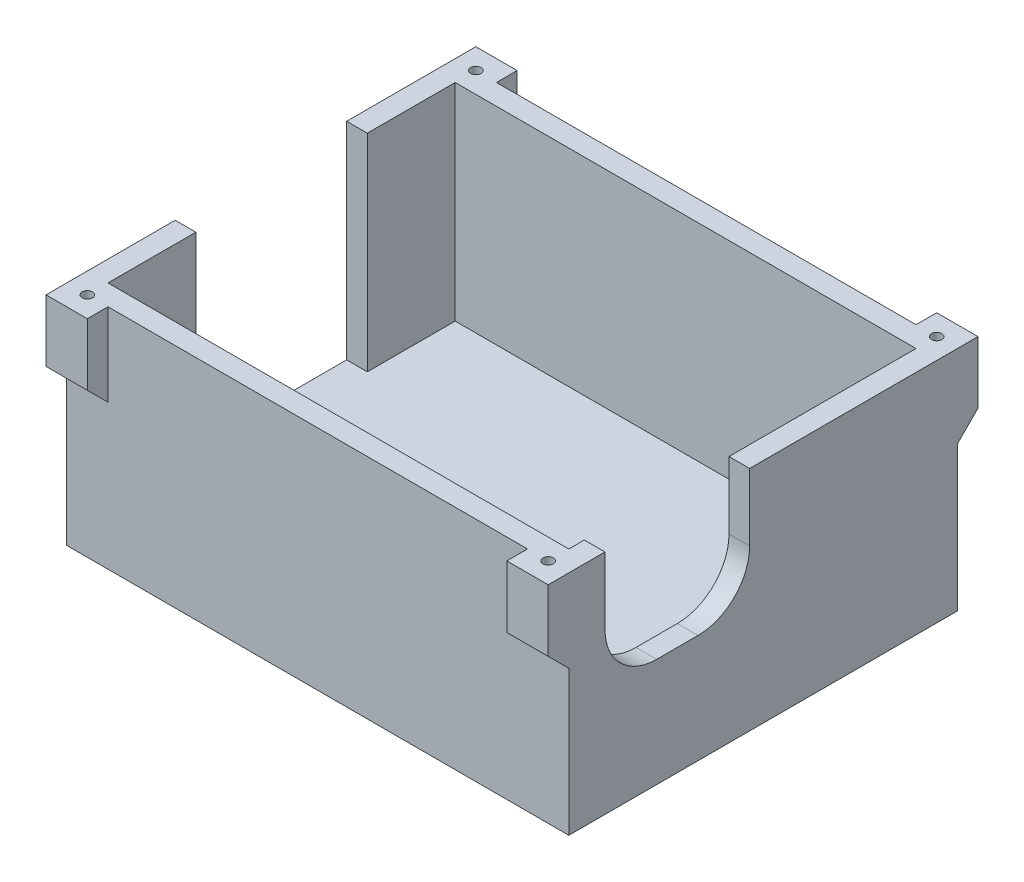
ISO-10303-21;
HEADER;
FILE_DESCRIPTION(('STEP AP214'),'2;1');
FILE_NAME('part.step','',(''),(''),'','','');
FILE_SCHEMA(('AUTOMOTIVE_DESIGN { 1 0 10303 214 1 1 1 1 }'));
ENDSEC;
DATA;
#1=APPLICATION_CONTEXT('core data for automotive mechanical design processes');
#2=APPLICATION_PROTOCOL_DEFINITION('international standard','automotive_design',2000,#1);
#3=PRODUCT_CONTEXT('',#1,'mechanical');
#4=PRODUCT('Part','Part','',(#3));
#5=PRODUCT_RELATED_PRODUCT_CATEGORY('part','',(#4));
#6=PRODUCT_DEFINITION_FORMATION('','',#4);
#7=PRODUCT_DEFINITION_CONTEXT('part definition',#1,'design');
#8=PRODUCT_DEFINITION('design','',#6,#7);
#9=PRODUCT_DEFINITION_SHAPE('','',#8);
#10=(LENGTH_UNIT() NAMED_UNIT(*) SI_UNIT(.MILLI.,.METRE.));
#11=(NAMED_UNIT(*) PLANE_ANGLE_UNIT() SI_UNIT($,.RADIAN.));
#12=(NAMED_UNIT(*) SI_UNIT($,.STERADIAN.) SOLID_ANGLE_UNIT());
#13=UNCERTAINTY_MEASURE_WITH_UNIT(LENGTH_MEASURE(1.E-05),#10,'distance_accuracy_value','');
#14=(GEOMETRIC_REPRESENTATION_CONTEXT(3) GLOBAL_UNCERTAINTY_ASSIGNED_CONTEXT((#13)) GLOBAL_UNIT_ASSIGNED_CONTEXT((#10,
#11,#12)) REPRESENTATION_CONTEXT('',''));
#15=CARTESIAN_POINT('',(0.,0.,0.));
#16=DIRECTION('',(0.,0.,1.));
#17=DIRECTION('',(1.,0.,0.));
#18=AXIS2_PLACEMENT_3D('',#15,#16,#17);
#19=CARTESIAN_POINT('',(0.,2.,-35.3));
#20=DIRECTION('',(0.,0.,-1.));
#21=DIRECTION('',(-1.,0.,0.));
#22=AXIS2_PLACEMENT_3D('',#19,#20,#21);
#23=PLANE('',#22);
#24=DIRECTION('',(0.,-1.,0.));
#25=VECTOR('',#24,1.);
#26=CARTESIAN_POINT('',(-2.3,2.,-35.3));
#27=LINE('',#26,#25);
#28=CARTESIAN_POINT('',(-2.3,14.,-35.3));
#29=VERTEX_POINT('',#28);
#30=CARTESIAN_POINT('',(-2.3,0.,-35.3));
#31=VERTEX_POINT('',#30);
#32=EDGE_CURVE('E418',#29,#31,#27,.T.);
#33=ORIENTED_EDGE('',*,*,#32,.F.);
#34=DIRECTION('',(1.,0.,0.));
#35=VECTOR('',#34,1.);
#36=CARTESIAN_POINT('',(1.7,14.,-35.3));
#37=LINE('',#36,#35);
#38=CARTESIAN_POINT('',(1.7,14.,-35.3));
#39=VERTEX_POINT('',#38);
#40=EDGE_CURVE('E451',#29,#39,#37,.T.);
#41=ORIENTED_EDGE('',*,*,#40,.T.);
#42=DIRECTION('',(0.,1.,0.));
#43=VECTOR('',#42,1.);
#44=CARTESIAN_POINT('',(1.7,16.,-35.3));
#45=LINE('',#44,#43);
#46=CARTESIAN_POINT('',(1.7,22.,-35.3));
#47=VERTEX_POINT('',#46);
#48=EDGE_CURVE('E54',#39,#47,#45,.T.);
#49=ORIENTED_EDGE('',*,*,#48,.T.);
#50=DIRECTION('',(1.,0.,0.));
#51=VECTOR('',#50,1.);
#52=CARTESIAN_POINT('',(0.,22.,-35.3));
#53=LINE('',#52,#51);
#54=CARTESIAN_POINT('',(42.3,22.,-35.3));
#55=VERTEX_POINT('',#54);
#56=EDGE_CURVE('E367',#47,#55,#53,.T.);
#57=ORIENTED_EDGE('',*,*,#56,.T.);
#58=DIRECTION('',(0.,1.,0.));
#59=VECTOR('',#58,1.);
#60=CARTESIAN_POINT('',(42.3,16.,-35.3));
#61=LINE('',#60,#59);
#62=CARTESIAN_POINT('',(42.3,14.,-35.3));
#63=VERTEX_POINT('',#62);
#64=EDGE_CURVE('E62',#63,#55,#61,.T.);
#65=ORIENTED_EDGE('',*,*,#64,.F.);
#66=DIRECTION('',(1.,0.,0.));
#67=VECTOR('',#66,1.);
#68=CARTESIAN_POINT('',(0.,14.,-35.3));
#69=LINE('',#68,#67);
#70=CARTESIAN_POINT('',(46.3,14.,-35.3));
#71=VERTEX_POINT('',#70);
#72=EDGE_CURVE('E449',#63,#71,#69,.T.);
#73=ORIENTED_EDGE('',*,*,#72,.T.);
#74=DIRECTION('',(0.,-1.,0.));
#75=VECTOR('',#74,1.);
#76=CARTESIAN_POINT('',(46.3,2.,-35.3));
#77=LINE('',#76,#75);
#78=CARTESIAN_POINT('',(46.3,0.,-35.3));
#79=VERTEX_POINT('',#78);
#80=EDGE_CURVE('E242',#71,#79,#77,.T.);
#81=ORIENTED_EDGE('',*,*,#80,.T.);
#82=DIRECTION('',(1.,0.,0.));
#83=VECTOR('',#82,1.);
#84=CARTESIAN_POINT('',(0.,0.,-35.3));
#85=LINE('',#84,#83);
#86=EDGE_CURVE('E415',#31,#79,#85,.T.);
#87=ORIENTED_EDGE('',*,*,#86,.F.);
#88=EDGE_LOOP('',(#33,#41,#49,#57,#65,#73,#81,#87));
#89=FACE_BOUND('',#88,.T.);
#90=ADVANCED_FACE('F38',(#89),#23,.T.);
#91=CARTESIAN_POINT('',(0.,22.,0.));
#92=DIRECTION('',(0.,1.,0.));
#93=DIRECTION('',(0.,0.,1.));
#94=AXIS2_PLACEMENT_3D('',#91,#92,#93);
#95=PLANE('',#94);
#96=CARTESIAN_POINT('',(44.3,22.,-35.3));
#97=DIRECTION('',(0.,1.,0.));
#98=DIRECTION('',(0.,0.,1.));
#99=AXIS2_PLACEMENT_3D('',#96,#97,#98);
#100=CIRCLE('',#99,0.499999999999999);
#101=CARTESIAN_POINT('',(44.3,22.,-34.8));
#102=VERTEX_POINT('',#101);
#103=EDGE_CURVE('E969',#102,#102,#100,.T.);
#104=ORIENTED_EDGE('',*,*,#103,.F.);
#105=EDGE_LOOP('',(#104));
#106=FACE_BOUND('',#105,.T.);
#107=CARTESIAN_POINT('',(-0.300000000000002,22.,-35.3));
#108=DIRECTION('',(0.,1.,0.));
#109=DIRECTION('',(0.,0.,1.));
#110=AXIS2_PLACEMENT_3D('',#107,#108,#109);
#111=CIRCLE('',#110,0.5);
#112=CARTESIAN_POINT('',(-0.300000000000002,22.,-34.8));
#113=VERTEX_POINT('',#112);
#114=EDGE_CURVE('E968',#113,#113,#111,.T.);
#115=ORIENTED_EDGE('',*,*,#114,.F.);
#116=EDGE_LOOP('',(#115));
#117=FACE_BOUND('',#116,.T.);
#118=DIRECTION('',(-1.,0.,0.));
#119=VECTOR('',#118,1.);
#120=CARTESIAN_POINT('',(44.3,22.,-15.2));
#121=LINE('',#120,#119);
#122=CARTESIAN_POINT('',(46.3,22.,-15.2));
#123=VERTEX_POINT('',#122);
#124=CARTESIAN_POINT('',(44.3,22.,-15.2));
#125=VERTEX_POINT('',#124);
#126=EDGE_CURVE('E327',#123,#125,#121,.T.);
#127=ORIENTED_EDGE('',*,*,#126,.F.);
#128=DIRECTION('',(0.,0.,-1.));
#129=VECTOR('',#128,1.);
#130=CARTESIAN_POINT('',(46.3,22.,0.));
#131=LINE('',#130,#129);
#132=CARTESIAN_POINT('',(46.3,22.,-37.3));
#133=VERTEX_POINT('',#132);
#134=EDGE_CURVE('E369',#123,#133,#131,.T.);
#135=ORIENTED_EDGE('',*,*,#134,.T.);
#136=DIRECTION('',(-1.,0.,0.));
#137=VECTOR('',#136,1.);
#138=CARTESIAN_POINT('',(46.3,22.,-37.3));
#139=LINE('',#138,#137);
#140=CARTESIAN_POINT('',(42.3,22.,-37.3));
#141=VERTEX_POINT('',#140);
#142=EDGE_CURVE('E253',#133,#141,#139,.T.);
#143=ORIENTED_EDGE('',*,*,#142,.T.);
#144=DIRECTION('',(0.,0.,1.));
#145=VECTOR('',#144,1.);
#146=CARTESIAN_POINT('',(42.3,22.,-35.3));
#147=LINE('',#146,#145);
#148=EDGE_CURVE('E256',#141,#55,#147,.T.);
#149=ORIENTED_EDGE('',*,*,#148,.T.);
#150=ORIENTED_EDGE('',*,*,#56,.F.);
#151=DIRECTION('',(0.,0.,-1.));
#152=VECTOR('',#151,1.);
#153=CARTESIAN_POINT('',(1.7,22.,-35.3));
#154=LINE('',#153,#152);
#155=CARTESIAN_POINT('',(1.7,22.,-37.3));
#156=VERTEX_POINT('',#155);
#157=EDGE_CURVE('E267',#47,#156,#154,.T.);
#158=ORIENTED_EDGE('',*,*,#157,.T.);
#159=DIRECTION('',(-1.,0.,0.));
#160=VECTOR('',#159,1.);
#161=CARTESIAN_POINT('',(-2.3,22.,-37.3));
#162=LINE('',#161,#160);
#163=CARTESIAN_POINT('',(-2.3,22.,-37.3));
#164=VERTEX_POINT('',#163);
#165=EDGE_CURVE('E272',#156,#164,#162,.T.);
#166=ORIENTED_EDGE('',*,*,#165,.T.);
#167=DIRECTION('',(0.,0.,-1.));
#168=VECTOR('',#167,1.);
#169=CARTESIAN_POINT('',(-2.3,22.,0.));
#170=LINE('',#169,#168);
#171=CARTESIAN_POINT('',(-2.3,22.,-24.8));
#172=VERTEX_POINT('',#171);
#173=EDGE_CURVE('E375',#172,#164,#170,.T.);
#174=ORIENTED_EDGE('',*,*,#173,.F.);
#175=DIRECTION('',(-1.,0.,0.));
#176=VECTOR('',#175,1.);
#177=CARTESIAN_POINT('',(-0.3,22.,-24.8));
#178=LINE('',#177,#176);
#179=CARTESIAN_POINT('',(-0.3,22.,-24.8));
#180=VERTEX_POINT('',#179);
#181=EDGE_CURVE('E324',#180,#172,#178,.T.);
#182=ORIENTED_EDGE('',*,*,#181,.F.);
#183=DIRECTION('',(0.,0.,-1.));
#184=VECTOR('',#183,1.);
#185=CARTESIAN_POINT('',(-0.3,22.,0.));
#186=LINE('',#185,#184);
#187=CARTESIAN_POINT('',(-0.3,22.,-33.3));
#188=VERTEX_POINT('',#187);
#189=EDGE_CURVE('E360',#180,#188,#186,.T.);
#190=ORIENTED_EDGE('',*,*,#189,.T.);
#191=DIRECTION('',(1.,0.,0.));
#192=VECTOR('',#191,1.);
#193=CARTESIAN_POINT('',(0.,22.,-33.3));
#194=LINE('',#193,#192);
#195=CARTESIAN_POINT('',(44.3,22.,-33.3));
#196=VERTEX_POINT('',#195);
#197=EDGE_CURVE('E357',#188,#196,#194,.T.);
#198=ORIENTED_EDGE('',*,*,#197,.T.);
#199=DIRECTION('',(0.,0.,-1.));
#200=VECTOR('',#199,1.);
#201=CARTESIAN_POINT('',(44.3,22.,0.));
#202=LINE('',#201,#200);
#203=EDGE_CURVE('E391',#125,#196,#202,.T.);
#204=ORIENTED_EDGE('',*,*,#203,.F.);
#205=EDGE_LOOP('',(#127,#135,#143,#149,#150,#158,#166,#174,#182,#190,#198,#204));
#206=FACE_BOUND('',#205,.T.);
#207=ADVANCED_FACE('F484',(#106,#117,#206),#95,.T.);
#208=CARTESIAN_POINT('',(-0.3,103.44688763477,0.));
#209=DIRECTION('',(-1.,0.,0.));
#210=DIRECTION('',(0.,0.,1.));
#211=AXIS2_PLACEMENT_3D('',#208,#209,#210);
#212=PLANE('',#211);
#213=DIRECTION('',(0.,0.,1.));
#214=VECTOR('',#213,1.);
#215=CARTESIAN_POINT('',(-0.3,2.,0.));
#216=LINE('',#215,#214);
#217=CARTESIAN_POINT('',(-0.3,2.,-8.2));
#218=VERTEX_POINT('',#217);
#219=CARTESIAN_POINT('',(-0.3,2.,0.3));
#220=VERTEX_POINT('',#219);
#221=EDGE_CURVE('E398',#218,#220,#216,.T.);
#222=ORIENTED_EDGE('',*,*,#221,.F.);
#223=DIRECTION('',(0.,1.,0.));
#224=VECTOR('',#223,1.);
#225=CARTESIAN_POINT('',(-0.3,-14.7200478468215,-8.2));
#226=LINE('',#225,#224);
#227=CARTESIAN_POINT('',(-0.3,22.,-8.2));
#228=VERTEX_POINT('',#227);
#229=EDGE_CURVE('E341',#218,#228,#226,.T.);
#230=ORIENTED_EDGE('',*,*,#229,.T.);
#231=CARTESIAN_POINT('',(-0.3,22.,0.3));
#232=VERTEX_POINT('',#231);
#233=EDGE_CURVE('E361',#232,#228,#186,.T.);
#234=ORIENTED_EDGE('',*,*,#233,.F.);
#235=DIRECTION('',(0.,-1.,0.));
#236=VECTOR('',#235,1.);
#237=CARTESIAN_POINT('',(-0.3,103.44688763477,0.3));
#238=LINE('',#237,#236);
#239=EDGE_CURVE('E388',#232,#220,#238,.T.);
#240=ORIENTED_EDGE('',*,*,#239,.T.);
#241=EDGE_LOOP('',(#222,#230,#234,#240));
#242=FACE_BOUND('',#241,.T.);
#243=ADVANCED_FACE('F580',(#242),#212,.F.);
#244=CARTESIAN_POINT('',(-2.3,2.,0.));
#245=DIRECTION('',(-1.,0.,0.));
#246=DIRECTION('',(0.,0.,1.));
#247=AXIS2_PLACEMENT_3D('',#244,#245,#246);
#248=PLANE('',#247);
#249=DIRECTION('',(0.,1.,0.));
#250=VECTOR('',#249,1.);
#251=CARTESIAN_POINT('',(-2.3,-14.7200478468215,-8.2));
#252=LINE('',#251,#250);
#253=CARTESIAN_POINT('',(-2.3,2.,-8.2));
#254=VERTEX_POINT('',#253);
#255=CARTESIAN_POINT('',(-2.3,22.,-8.2));
#256=VERTEX_POINT('',#255);
#257=EDGE_CURVE('E350',#254,#256,#252,.T.);
#258=ORIENTED_EDGE('',*,*,#257,.F.);
#259=DIRECTION('',(0.,0.,-1.));
#260=VECTOR('',#259,1.);
#261=CARTESIAN_POINT('',(-2.3,2.,-8.2));
#262=LINE('',#261,#260);
#263=CARTESIAN_POINT('',(-2.3,2.,-24.8));
#264=VERTEX_POINT('',#263);
#265=EDGE_CURVE('E337',#254,#264,#262,.T.);
#266=ORIENTED_EDGE('',*,*,#265,.T.);
#267=DIRECTION('',(0.,1.,0.));
#268=VECTOR('',#267,1.);
#269=CARTESIAN_POINT('',(-2.3,-14.7200478468215,-24.8));
#270=LINE('',#269,#268);
#271=EDGE_CURVE('E352',#264,#172,#270,.T.);
#272=ORIENTED_EDGE('',*,*,#271,.T.);
#273=ORIENTED_EDGE('',*,*,#173,.T.);
#274=DIRECTION('',(0.,1.,0.));
#275=VECTOR('',#274,1.);
#276=CARTESIAN_POINT('',(-2.3,16.,-37.3));
#277=LINE('',#276,#275);
#278=CARTESIAN_POINT('',(-2.3,16.,-37.3));
#279=VERTEX_POINT('',#278);
#280=EDGE_CURVE('E277',#279,#164,#277,.T.);
#281=ORIENTED_EDGE('',*,*,#280,.F.);
#282=DIRECTION('',(0.,0.707106781186551,-0.707106781186544));
#283=VECTOR('',#282,1.);
#284=CARTESIAN_POINT('',(-2.3,14.,-35.3));
#285=LINE('',#284,#283);
#286=EDGE_CURVE('E246',#279,#29,#285,.F.);
#287=ORIENTED_EDGE('',*,*,#286,.T.);
#288=ORIENTED_EDGE('',*,*,#32,.T.);
#289=DIRECTION('',(0.,0.,-1.));
#290=VECTOR('',#289,1.);
#291=CARTESIAN_POINT('',(-2.3,0.,0.));
#292=LINE('',#291,#290);
#293=CARTESIAN_POINT('',(-2.3,0.,2.3));
#294=VERTEX_POINT('',#293);
#295=EDGE_CURVE('E407',#294,#31,#292,.T.);
#296=ORIENTED_EDGE('',*,*,#295,.F.);
#297=DIRECTION('',(0.,-1.,0.));
#298=VECTOR('',#297,1.);
#299=CARTESIAN_POINT('',(-2.3,2.,2.3));
#300=LINE('',#299,#298);
#301=CARTESIAN_POINT('',(-2.3,14.,2.3));
#302=VERTEX_POINT('',#301);
#303=EDGE_CURVE('E423',#302,#294,#300,.T.);
#304=ORIENTED_EDGE('',*,*,#303,.F.);
#305=DIRECTION('',(0.,-0.707106781186552,-0.707106781186543));
#306=VECTOR('',#305,1.);
#307=CARTESIAN_POINT('',(-2.3,14.,2.3));
#308=LINE('',#307,#306);
#309=CARTESIAN_POINT('',(-2.3,16.,4.3));
#310=VERTEX_POINT('',#309);
#311=EDGE_CURVE('E454',#302,#310,#308,.F.);
#312=ORIENTED_EDGE('',*,*,#311,.T.);
#313=DIRECTION('',(0.,1.,0.));
#314=VECTOR('',#313,1.);
#315=CARTESIAN_POINT('',(-2.3,16.,4.3));
#316=LINE('',#315,#314);
#317=CARTESIAN_POINT('',(-2.3,22.,4.3));
#318=VERTEX_POINT('',#317);
#319=EDGE_CURVE('E287',#310,#318,#316,.T.);
#320=ORIENTED_EDGE('',*,*,#319,.T.);
#321=EDGE_CURVE('E376',#318,#256,#170,.T.);
#322=ORIENTED_EDGE('',*,*,#321,.T.);
#323=EDGE_LOOP('',(#258,#266,#272,#273,#281,#287,#288,#296,#304,#312,#320,#322));
#324=FACE_BOUND('',#323,.T.);
#325=ADVANCED_FACE('F469',(#324),#248,.T.);
#326=CARTESIAN_POINT('',(0.,2.,2.3));
#327=DIRECTION('',(0.,0.,-1.));
#328=DIRECTION('',(-1.,0.,0.));
#329=AXIS2_PLACEMENT_3D('',#326,#327,#328);
#330=PLANE('',#329);
#331=DIRECTION('',(0.,1.,0.));
#332=VECTOR('',#331,1.);
#333=CARTESIAN_POINT('',(1.7,16.,2.3));
#334=LINE('',#333,#332);
#335=CARTESIAN_POINT('',(1.7,14.,2.3));
#336=VERTEX_POINT('',#335);
#337=CARTESIAN_POINT('',(1.7,22.,2.3));
#338=VERTEX_POINT('',#337);
#339=EDGE_CURVE('E292',#336,#338,#334,.T.);
#340=ORIENTED_EDGE('',*,*,#339,.F.);
#341=DIRECTION('',(-1.,0.,0.));
#342=VECTOR('',#341,1.);
#343=CARTESIAN_POINT('',(-2.3,14.,2.3));
#344=LINE('',#343,#342);
#345=EDGE_CURVE('E446',#336,#302,#344,.T.);
#346=ORIENTED_EDGE('',*,*,#345,.T.);
#347=ORIENTED_EDGE('',*,*,#303,.T.);
#348=DIRECTION('',(1.,0.,0.));
#349=VECTOR('',#348,1.);
#350=CARTESIAN_POINT('',(0.,0.,2.3));
#351=LINE('',#350,#349);
#352=CARTESIAN_POINT('',(46.3,0.,2.3));
#353=VERTEX_POINT('',#352);
#354=EDGE_CURVE('E410',#294,#353,#351,.T.);
#355=ORIENTED_EDGE('',*,*,#354,.T.);
#356=DIRECTION('',(0.,-1.,0.));
#357=VECTOR('',#356,1.);
#358=CARTESIAN_POINT('',(46.3,2.,2.3));
#359=LINE('',#358,#357);
#360=CARTESIAN_POINT('',(46.3,14.,2.3));
#361=VERTEX_POINT('',#360);
#362=EDGE_CURVE('E421',#361,#353,#359,.T.);
#363=ORIENTED_EDGE('',*,*,#362,.F.);
#364=DIRECTION('',(-1.,0.,0.));
#365=VECTOR('',#364,1.);
#366=CARTESIAN_POINT('',(0.,14.,2.3));
#367=LINE('',#366,#365);
#368=CARTESIAN_POINT('',(42.3,14.,2.3));
#369=VERTEX_POINT('',#368);
#370=EDGE_CURVE('E443',#361,#369,#367,.T.);
#371=ORIENTED_EDGE('',*,*,#370,.T.);
#372=DIRECTION('',(0.,1.,0.));
#373=VECTOR('',#372,1.);
#374=CARTESIAN_POINT('',(42.3,16.,2.3));
#375=LINE('',#374,#373);
#376=CARTESIAN_POINT('',(42.3,22.,2.3));
#377=VERTEX_POINT('',#376);
#378=EDGE_CURVE('E303',#369,#377,#375,.T.);
#379=ORIENTED_EDGE('',*,*,#378,.T.);
#380=DIRECTION('',(1.,0.,0.));
#381=VECTOR('',#380,1.);
#382=CARTESIAN_POINT('',(0.,22.,2.3));
#383=LINE('',#382,#381);
#384=EDGE_CURVE('E373',#338,#377,#383,.T.);
#385=ORIENTED_EDGE('',*,*,#384,.F.);
#386=EDGE_LOOP('',(#340,#346,#347,#355,#363,#371,#379,#385));
#387=FACE_BOUND('',#386,.T.);
#388=ADVANCED_FACE('F530',(#387),#330,.F.);
#389=CARTESIAN_POINT('',(46.3,2.,0.));
#390=DIRECTION('',(-1.,0.,0.));
#391=DIRECTION('',(0.,0.,1.));
#392=AXIS2_PLACEMENT_3D('',#389,#390,#391);
#393=PLANE('',#392);
#394=ORIENTED_EDGE('',*,*,#134,.F.);
#395=DIRECTION('',(0.,1.,0.));
#396=VECTOR('',#395,1.);
#397=CARTESIAN_POINT('',(46.3,-12.142135623731,-15.2));
#398=LINE('',#397,#396);
#399=CARTESIAN_POINT('',(46.3,15.5,-15.2));
#400=VERTEX_POINT('',#399);
#401=EDGE_CURVE('E332',#400,#123,#398,.T.);
#402=ORIENTED_EDGE('',*,*,#401,.F.);
#403=CARTESIAN_POINT('',(46.3,15.5,-10.2));
#404=DIRECTION('',(-1.,0.,0.));
#405=DIRECTION('',(0.,0.,1.));
#406=AXIS2_PLACEMENT_3D('',#403,#404,#405);
#407=CIRCLE('',#406,5.);
#408=CARTESIAN_POINT('',(46.3,10.5,-10.2));
#409=VERTEX_POINT('',#408);
#410=EDGE_CURVE('E435',#400,#409,#407,.T.);
#411=ORIENTED_EDGE('',*,*,#410,.T.);
#412=DIRECTION('',(0.,0.,1.));
#413=VECTOR('',#412,1.);
#414=CARTESIAN_POINT('',(46.3,10.5,-1.2));
#415=LINE('',#414,#413);
#416=CARTESIAN_POINT('',(46.3,10.5,-6.2));
#417=VERTEX_POINT('',#416);
#418=EDGE_CURVE('E317',#409,#417,#415,.T.);
#419=ORIENTED_EDGE('',*,*,#418,.T.);
#420=CARTESIAN_POINT('',(46.3,15.5,-6.2));
#421=DIRECTION('',(-1.,0.,0.));
#422=DIRECTION('',(0.,0.,1.));
#423=AXIS2_PLACEMENT_3D('',#420,#421,#422);
#424=CIRCLE('',#423,5.);
#425=CARTESIAN_POINT('',(46.3,15.5,-1.2));
#426=VERTEX_POINT('',#425);
#427=EDGE_CURVE('E441',#417,#426,#424,.T.);
#428=ORIENTED_EDGE('',*,*,#427,.T.);
#429=DIRECTION('',(0.,1.,0.));
#430=VECTOR('',#429,1.);
#431=CARTESIAN_POINT('',(46.3,-12.142135623731,-1.2));
#432=LINE('',#431,#430);
#433=CARTESIAN_POINT('',(46.3,22.,-1.2));
#434=VERTEX_POINT('',#433);
#435=EDGE_CURVE('E334',#426,#434,#432,.T.);
#436=ORIENTED_EDGE('',*,*,#435,.T.);
#437=CARTESIAN_POINT('',(46.3,22.,4.3));
#438=VERTEX_POINT('',#437);
#439=EDGE_CURVE('E370',#438,#434,#131,.T.);
#440=ORIENTED_EDGE('',*,*,#439,.F.);
#441=DIRECTION('',(0.,1.,0.));
#442=VECTOR('',#441,1.);
#443=CARTESIAN_POINT('',(46.3,16.,4.3));
#444=LINE('',#443,#442);
#445=CARTESIAN_POINT('',(46.3,16.,4.3));
#446=VERTEX_POINT('',#445);
#447=EDGE_CURVE('E309',#446,#438,#444,.T.);
#448=ORIENTED_EDGE('',*,*,#447,.F.);
#449=DIRECTION('',(0.,-0.707106781186552,-0.707106781186543));
#450=VECTOR('',#449,1.);
#451=CARTESIAN_POINT('',(46.3,6.8499999999999,-4.84999999999998));
#452=LINE('',#451,#450);
#453=EDGE_CURVE('E461',#446,#361,#452,.T.);
#454=ORIENTED_EDGE('',*,*,#453,.T.);
#455=ORIENTED_EDGE('',*,*,#362,.T.);
#456=DIRECTION('',(0.,0.,-1.));
#457=VECTOR('',#456,1.);
#458=CARTESIAN_POINT('',(46.3,0.,0.));
#459=LINE('',#458,#457);
#460=EDGE_CURVE('E413',#353,#79,#459,.T.);
#461=ORIENTED_EDGE('',*,*,#460,.T.);
#462=ORIENTED_EDGE('',*,*,#80,.F.);
#463=DIRECTION('',(0.,0.707106781186551,-0.707106781186544));
#464=VECTOR('',#463,1.);
#465=CARTESIAN_POINT('',(46.3,-9.65000000000007,-11.6500000000002));
#466=LINE('',#465,#464);
#467=CARTESIAN_POINT('',(46.3,16.,-37.3));
#468=VERTEX_POINT('',#467);
#469=EDGE_CURVE('E47',#71,#468,#466,.T.);
#470=ORIENTED_EDGE('',*,*,#469,.T.);
#471=DIRECTION('',(0.,1.,0.));
#472=VECTOR('',#471,1.);
#473=CARTESIAN_POINT('',(46.3,16.,-37.3));
#474=LINE('',#473,#472);
#475=EDGE_CURVE('E239',#468,#133,#474,.T.);
#476=ORIENTED_EDGE('',*,*,#475,.T.);
#477=EDGE_LOOP('',(#394,#402,#411,#419,#428,#436,#440,#448,#454,#455,#461,#462,#470,#476));
#478=FACE_BOUND('',#477,.T.);
#479=ADVANCED_FACE('F238',(#478),#393,.F.);
#480=CARTESIAN_POINT('',(0.,0.,0.));
#481=DIRECTION('',(0.,1.,0.));
#482=DIRECTION('',(0.,0.,1.));
#483=AXIS2_PLACEMENT_3D('',#480,#481,#482);
#484=PLANE('',#483);
#485=ORIENTED_EDGE('',*,*,#295,.T.);
#486=ORIENTED_EDGE('',*,*,#86,.T.);
#487=ORIENTED_EDGE('',*,*,#460,.F.);
#488=ORIENTED_EDGE('',*,*,#354,.F.);
#489=EDGE_LOOP('',(#485,#486,#487,#488));
#490=FACE_BOUND('',#489,.T.);
#491=ADVANCED_FACE('F539',(#490),#484,.F.);
#492=CARTESIAN_POINT('',(44.3,103.44688763477,0.));
#493=DIRECTION('',(-1.,0.,0.));
#494=DIRECTION('',(0.,0.,1.));
#495=AXIS2_PLACEMENT_3D('',#492,#493,#494);
#496=PLANE('',#495);
#497=DIRECTION('',(0.,0.,-1.));
#498=VECTOR('',#497,1.);
#499=CARTESIAN_POINT('',(44.3,10.5,-1.2));
#500=LINE('',#499,#498);
#501=CARTESIAN_POINT('',(44.3,10.5,-6.2));
#502=VERTEX_POINT('',#501);
#503=CARTESIAN_POINT('',(44.3,10.5,-10.2));
#504=VERTEX_POINT('',#503);
#505=EDGE_CURVE('E320',#502,#504,#500,.T.);
#506=ORIENTED_EDGE('',*,*,#505,.T.);
#507=CARTESIAN_POINT('',(44.3,15.5,-10.2));
#508=DIRECTION('',(-1.,0.,0.));
#509=DIRECTION('',(0.,0.,1.));
#510=AXIS2_PLACEMENT_3D('',#507,#508,#509);
#511=CIRCLE('',#510,5.);
#512=CARTESIAN_POINT('',(44.3,15.5,-15.2));
#513=VERTEX_POINT('',#512);
#514=EDGE_CURVE('E437',#504,#513,#511,.F.);
#515=ORIENTED_EDGE('',*,*,#514,.T.);
#516=DIRECTION('',(0.,1.,0.));
#517=VECTOR('',#516,1.);
#518=CARTESIAN_POINT('',(44.3,-12.142135623731,-15.2));
#519=LINE('',#518,#517);
#520=EDGE_CURVE('E321',#513,#125,#519,.T.);
#521=ORIENTED_EDGE('',*,*,#520,.T.);
#522=ORIENTED_EDGE('',*,*,#203,.T.);
#523=DIRECTION('',(0.,-1.,0.));
#524=VECTOR('',#523,1.);
#525=CARTESIAN_POINT('',(44.3,103.44688763477,-33.3));
#526=LINE('',#525,#524);
#527=CARTESIAN_POINT('',(44.3,2.,-33.3));
#528=VERTEX_POINT('',#527);
#529=EDGE_CURVE('E382',#196,#528,#526,.T.);
#530=ORIENTED_EDGE('',*,*,#529,.T.);
#531=DIRECTION('',(0.,0.,1.));
#532=VECTOR('',#531,1.);
#533=CARTESIAN_POINT('',(44.3,2.,0.));
#534=LINE('',#533,#532);
#535=CARTESIAN_POINT('',(44.3,2.,0.3));
#536=VERTEX_POINT('',#535);
#537=EDGE_CURVE('E404',#528,#536,#534,.T.);
#538=ORIENTED_EDGE('',*,*,#537,.T.);
#539=DIRECTION('',(0.,-1.,0.));
#540=VECTOR('',#539,1.);
#541=CARTESIAN_POINT('',(44.3,103.44688763477,0.3));
#542=LINE('',#541,#540);
#543=CARTESIAN_POINT('',(44.3,22.,0.3));
#544=VERTEX_POINT('',#543);
#545=EDGE_CURVE('E379',#544,#536,#542,.T.);
#546=ORIENTED_EDGE('',*,*,#545,.F.);
#547=CARTESIAN_POINT('',(44.3,22.,-1.2));
#548=VERTEX_POINT('',#547);
#549=EDGE_CURVE('E392',#544,#548,#202,.T.);
#550=ORIENTED_EDGE('',*,*,#549,.T.);
#551=DIRECTION('',(0.,1.,0.));
#552=VECTOR('',#551,1.);
#553=CARTESIAN_POINT('',(44.3,-12.142135623731,-1.2));
#554=LINE('',#553,#552);
#555=CARTESIAN_POINT('',(44.3,15.5,-1.2));
#556=VERTEX_POINT('',#555);
#557=EDGE_CURVE('E330',#556,#548,#554,.T.);
#558=ORIENTED_EDGE('',*,*,#557,.F.);
#559=CARTESIAN_POINT('',(44.3,15.5,-6.2));
#560=DIRECTION('',(-1.,0.,0.));
#561=DIRECTION('',(0.,0.,1.));
#562=AXIS2_PLACEMENT_3D('',#559,#560,#561);
#563=CIRCLE('',#562,5.);
#564=EDGE_CURVE('E439',#556,#502,#563,.F.);
#565=ORIENTED_EDGE('',*,*,#564,.T.);
#566=EDGE_LOOP('',(#506,#515,#521,#522,#530,#538,#546,#550,#558,#565));
#567=FACE_BOUND('',#566,.T.);
#568=ADVANCED_FACE('F506',(#567),#496,.T.);
#569=CARTESIAN_POINT('',(0.,103.44688763477,-33.3));
#570=DIRECTION('',(0.,0.,-1.));
#571=DIRECTION('',(-1.,0.,0.));
#572=AXIS2_PLACEMENT_3D('',#569,#570,#571);
#573=PLANE('',#572);
#574=DIRECTION('',(-1.,0.,0.));
#575=VECTOR('',#574,1.);
#576=CARTESIAN_POINT('',(0.,2.,-33.3));
#577=LINE('',#576,#575);
#578=CARTESIAN_POINT('',(-0.3,2.,-33.3));
#579=VERTEX_POINT('',#578);
#580=EDGE_CURVE('E402',#528,#579,#577,.T.);
#581=ORIENTED_EDGE('',*,*,#580,.F.);
#582=ORIENTED_EDGE('',*,*,#529,.F.);
#583=ORIENTED_EDGE('',*,*,#197,.F.);
#584=DIRECTION('',(0.,-1.,0.));
#585=VECTOR('',#584,1.);
#586=CARTESIAN_POINT('',(-0.3,103.44688763477,-33.3));
#587=LINE('',#586,#585);
#588=EDGE_CURVE('E385',#188,#579,#587,.T.);
#589=ORIENTED_EDGE('',*,*,#588,.T.);
#590=EDGE_LOOP('',(#581,#582,#583,#589));
#591=FACE_BOUND('',#590,.T.);
#592=ADVANCED_FACE('F573',(#591),#573,.F.);
#593=ORIENTED_EDGE('',*,*,#189,.F.);
#594=DIRECTION('',(0.,1.,0.));
#595=VECTOR('',#594,1.);
#596=CARTESIAN_POINT('',(-0.3,-14.7200478468215,-24.8));
#597=LINE('',#596,#595);
#598=CARTESIAN_POINT('',(-0.3,2.,-24.8));
#599=VERTEX_POINT('',#598);
#600=EDGE_CURVE('E347',#599,#180,#597,.T.);
#601=ORIENTED_EDGE('',*,*,#600,.F.);
#602=EDGE_CURVE('E399',#579,#599,#216,.T.);
#603=ORIENTED_EDGE('',*,*,#602,.F.);
#604=ORIENTED_EDGE('',*,*,#588,.F.);
#605=EDGE_LOOP('',(#593,#601,#603,#604));
#606=FACE_BOUND('',#605,.T.);
#607=ADVANCED_FACE('F567',(#606),#212,.F.);
#608=CARTESIAN_POINT('',(0.,103.44688763477,0.3));
#609=DIRECTION('',(0.,0.,-1.));
#610=DIRECTION('',(-1.,0.,0.));
#611=AXIS2_PLACEMENT_3D('',#608,#609,#610);
#612=PLANE('',#611);
#613=ORIENTED_EDGE('',*,*,#545,.T.);
#614=DIRECTION('',(-1.,0.,0.));
#615=VECTOR('',#614,1.);
#616=CARTESIAN_POINT('',(0.,2.,0.3));
#617=LINE('',#616,#615);
#618=EDGE_CURVE('E395',#536,#220,#617,.T.);
#619=ORIENTED_EDGE('',*,*,#618,.T.);
#620=ORIENTED_EDGE('',*,*,#239,.F.);
#621=DIRECTION('',(1.,0.,0.));
#622=VECTOR('',#621,1.);
#623=CARTESIAN_POINT('',(0.,22.,0.3));
#624=LINE('',#623,#622);
#625=EDGE_CURVE('E364',#232,#544,#624,.T.);
#626=ORIENTED_EDGE('',*,*,#625,.T.);
#627=EDGE_LOOP('',(#613,#619,#620,#626));
#628=FACE_BOUND('',#627,.T.);
#629=ADVANCED_FACE('F576',(#628),#612,.T.);
#630=CARTESIAN_POINT('',(-0.299999999999999,22.,2.3));
#631=DIRECTION('',(0.,1.,0.));
#632=DIRECTION('',(0.,0.,1.));
#633=AXIS2_PLACEMENT_3D('',#630,#631,#632);
#634=CIRCLE('',#633,0.5);
#635=CARTESIAN_POINT('',(-0.299999999999999,22.,2.8));
#636=VERTEX_POINT('',#635);
#637=EDGE_CURVE('E982',#636,#636,#634,.T.);
#638=ORIENTED_EDGE('',*,*,#637,.F.);
#639=EDGE_LOOP('',(#638));
#640=FACE_BOUND('',#639,.T.);
#641=CARTESIAN_POINT('',(44.3,22.,2.3));
#642=DIRECTION('',(0.,1.,0.));
#643=DIRECTION('',(0.,0.,1.));
#644=AXIS2_PLACEMENT_3D('',#641,#642,#643);
#645=CIRCLE('',#644,0.499999999999999);
#646=CARTESIAN_POINT('',(44.3,22.,2.8));
#647=VERTEX_POINT('',#646);
#648=EDGE_CURVE('E262',#647,#647,#645,.T.);
#649=ORIENTED_EDGE('',*,*,#648,.F.);
#650=EDGE_LOOP('',(#649));
#651=FACE_BOUND('',#650,.T.);
#652=DIRECTION('',(1.,0.,0.));
#653=VECTOR('',#652,1.);
#654=CARTESIAN_POINT('',(44.3,22.,-1.2));
#655=LINE('',#654,#653);
#656=EDGE_CURVE('E312',#548,#434,#655,.T.);
#657=ORIENTED_EDGE('',*,*,#656,.F.);
#658=ORIENTED_EDGE('',*,*,#549,.F.);
#659=ORIENTED_EDGE('',*,*,#625,.F.);
#660=ORIENTED_EDGE('',*,*,#233,.T.);
#661=DIRECTION('',(1.,0.,0.));
#662=VECTOR('',#661,1.);
#663=CARTESIAN_POINT('',(-0.3,22.,-8.2));
#664=LINE('',#663,#662);
#665=EDGE_CURVE('E345',#256,#228,#664,.T.);
#666=ORIENTED_EDGE('',*,*,#665,.F.);
#667=ORIENTED_EDGE('',*,*,#321,.F.);
#668=DIRECTION('',(1.,0.,0.));
#669=VECTOR('',#668,1.);
#670=CARTESIAN_POINT('',(-2.3,22.,4.3));
#671=LINE('',#670,#669);
#672=CARTESIAN_POINT('',(1.7,22.,4.3));
#673=VERTEX_POINT('',#672);
#674=EDGE_CURVE('E280',#318,#673,#671,.T.);
#675=ORIENTED_EDGE('',*,*,#674,.T.);
#676=DIRECTION('',(0.,0.,-1.));
#677=VECTOR('',#676,1.);
#678=CARTESIAN_POINT('',(1.7,22.,2.3));
#679=LINE('',#678,#677);
#680=EDGE_CURVE('E288',#673,#338,#679,.T.);
#681=ORIENTED_EDGE('',*,*,#680,.T.);
#682=ORIENTED_EDGE('',*,*,#384,.T.);
#683=DIRECTION('',(0.,0.,1.));
#684=VECTOR('',#683,1.);
#685=CARTESIAN_POINT('',(42.3,22.,2.3));
#686=LINE('',#685,#684);
#687=CARTESIAN_POINT('',(42.3,22.,4.3));
#688=VERTEX_POINT('',#687);
#689=EDGE_CURVE('E295',#377,#688,#686,.T.);
#690=ORIENTED_EDGE('',*,*,#689,.T.);
#691=DIRECTION('',(1.,0.,0.));
#692=VECTOR('',#691,1.);
#693=CARTESIAN_POINT('',(46.3,22.,4.3));
#694=LINE('',#693,#692);
#695=EDGE_CURVE('E304',#688,#438,#694,.T.);
#696=ORIENTED_EDGE('',*,*,#695,.T.);
#697=ORIENTED_EDGE('',*,*,#439,.T.);
#698=EDGE_LOOP('',(#657,#658,#659,#660,#666,#667,#675,#681,#682,#690,#696,#697));
#699=FACE_BOUND('',#698,.T.);
#700=ADVANCED_FACE('F523',(#640,#651,#699),#95,.T.);
#701=CARTESIAN_POINT('',(0.,2.,0.));
#702=DIRECTION('',(0.,1.,0.));
#703=DIRECTION('',(0.,0.,1.));
#704=AXIS2_PLACEMENT_3D('',#701,#702,#703);
#705=PLANE('',#704);
#706=ORIENTED_EDGE('',*,*,#537,.F.);
#707=ORIENTED_EDGE('',*,*,#580,.T.);
#708=ORIENTED_EDGE('',*,*,#602,.T.);
#709=DIRECTION('',(1.,0.,0.));
#710=VECTOR('',#709,1.);
#711=CARTESIAN_POINT('',(-0.3,2.,-24.8));
#712=LINE('',#711,#710);
#713=EDGE_CURVE('E343',#264,#599,#712,.T.);
#714=ORIENTED_EDGE('',*,*,#713,.F.);
#715=ORIENTED_EDGE('',*,*,#265,.F.);
#716=DIRECTION('',(-1.,0.,0.));
#717=VECTOR('',#716,1.);
#718=CARTESIAN_POINT('',(-0.3,2.,-8.2));
#719=LINE('',#718,#717);
#720=EDGE_CURVE('E340',#218,#254,#719,.T.);
#721=ORIENTED_EDGE('',*,*,#720,.F.);
#722=ORIENTED_EDGE('',*,*,#221,.T.);
#723=ORIENTED_EDGE('',*,*,#618,.F.);
#724=EDGE_LOOP('',(#706,#707,#708,#714,#715,#721,#722,#723));
#725=FACE_BOUND('',#724,.T.);
#726=ADVANCED_FACE('F560',(#725),#705,.T.);
#727=CARTESIAN_POINT('',(-0.3,-14.7200478468215,-8.2));
#728=DIRECTION('',(0.,0.,1.));
#729=DIRECTION('',(1.,0.,0.));
#730=AXIS2_PLACEMENT_3D('',#727,#728,#729);
#731=PLANE('',#730);
#732=ORIENTED_EDGE('',*,*,#720,.T.);
#733=ORIENTED_EDGE('',*,*,#257,.T.);
#734=ORIENTED_EDGE('',*,*,#665,.T.);
#735=ORIENTED_EDGE('',*,*,#229,.F.);
#736=EDGE_LOOP('',(#732,#733,#734,#735));
#737=FACE_BOUND('',#736,.T.);
#738=ADVANCED_FACE('F555',(#737),#731,.F.);
#739=CARTESIAN_POINT('',(-0.3,-14.7200478468215,-24.8));
#740=DIRECTION('',(0.,0.,-1.));
#741=DIRECTION('',(-1.,0.,0.));
#742=AXIS2_PLACEMENT_3D('',#739,#740,#741);
#743=PLANE('',#742);
#744=ORIENTED_EDGE('',*,*,#713,.T.);
#745=ORIENTED_EDGE('',*,*,#600,.T.);
#746=ORIENTED_EDGE('',*,*,#181,.T.);
#747=ORIENTED_EDGE('',*,*,#271,.F.);
#748=EDGE_LOOP('',(#744,#745,#746,#747));
#749=FACE_BOUND('',#748,.T.);
#750=ADVANCED_FACE('F564',(#749),#743,.F.);
#751=CARTESIAN_POINT('',(44.3,-12.142135623731,-15.2));
#752=DIRECTION('',(0.,0.,-1.));
#753=DIRECTION('',(-1.,0.,0.));
#754=AXIS2_PLACEMENT_3D('',#751,#752,#753);
#755=PLANE('',#754);
#756=ORIENTED_EDGE('',*,*,#520,.F.);
#757=DIRECTION('',(1.,0.,0.));
#758=VECTOR('',#757,1.);
#759=CARTESIAN_POINT('',(44.3,15.5,-15.2));
#760=LINE('',#759,#758);
#761=EDGE_CURVE('E425',#513,#400,#760,.T.);
#762=ORIENTED_EDGE('',*,*,#761,.T.);
#763=ORIENTED_EDGE('',*,*,#401,.T.);
#764=ORIENTED_EDGE('',*,*,#126,.T.);
#765=EDGE_LOOP('',(#756,#762,#763,#764));
#766=FACE_BOUND('',#765,.T.);
#767=ADVANCED_FACE('F495',(#766),#755,.F.);
#768=CARTESIAN_POINT('',(44.3,-12.142135623731,-1.2));
#769=DIRECTION('',(0.,0.,1.));
#770=DIRECTION('',(1.,0.,0.));
#771=AXIS2_PLACEMENT_3D('',#768,#769,#770);
#772=PLANE('',#771);
#773=ORIENTED_EDGE('',*,*,#435,.F.);
#774=DIRECTION('',(-1.,0.,0.));
#775=VECTOR('',#774,1.);
#776=CARTESIAN_POINT('',(44.3,15.5,-1.2));
#777=LINE('',#776,#775);
#778=EDGE_CURVE('E432',#426,#556,#777,.T.);
#779=ORIENTED_EDGE('',*,*,#778,.T.);
#780=ORIENTED_EDGE('',*,*,#557,.T.);
#781=ORIENTED_EDGE('',*,*,#656,.T.);
#782=EDGE_LOOP('',(#773,#779,#780,#781));
#783=FACE_BOUND('',#782,.T.);
#784=ADVANCED_FACE('F514',(#783),#772,.F.);
#785=CARTESIAN_POINT('',(0.,10.5,0.));
#786=DIRECTION('',(0.,1.,0.));
#787=DIRECTION('',(0.,0.,1.));
#788=AXIS2_PLACEMENT_3D('',#785,#786,#787);
#789=PLANE('',#788);
#790=ORIENTED_EDGE('',*,*,#418,.F.);
#791=DIRECTION('',(1.,0.,0.));
#792=VECTOR('',#791,1.);
#793=CARTESIAN_POINT('',(0.,10.5,-10.2));
#794=LINE('',#793,#792);
#795=EDGE_CURVE('E430',#409,#504,#794,.F.);
#796=ORIENTED_EDGE('',*,*,#795,.T.);
#797=ORIENTED_EDGE('',*,*,#505,.F.);
#798=DIRECTION('',(-1.,0.,0.));
#799=VECTOR('',#798,1.);
#800=CARTESIAN_POINT('',(0.,10.5,-6.19999999999999));
#801=LINE('',#800,#799);
#802=EDGE_CURVE('E428',#502,#417,#801,.F.);
#803=ORIENTED_EDGE('',*,*,#802,.T.);
#804=EDGE_LOOP('',(#790,#796,#797,#803));
#805=FACE_BOUND('',#804,.T.);
#806=ADVANCED_FACE('F503',(#805),#789,.T.);
#807=CARTESIAN_POINT('',(44.3,15.5,-10.2));
#808=DIRECTION('',(1.,0.,0.));
#809=DIRECTION('',(0.,0.,-1.));
#810=AXIS2_PLACEMENT_3D('',#807,#808,#809);
#811=CYLINDRICAL_SURFACE('',#810,5.);
#812=ORIENTED_EDGE('',*,*,#514,.F.);
#813=ORIENTED_EDGE('',*,*,#795,.F.);
#814=ORIENTED_EDGE('',*,*,#410,.F.);
#815=ORIENTED_EDGE('',*,*,#761,.F.);
#816=EDGE_LOOP('',(#812,#813,#814,#815));
#817=FACE_BOUND('',#816,.T.);
#818=ADVANCED_FACE('F499',(#817),#811,.F.);
#819=CARTESIAN_POINT('',(44.3,15.5,-6.2));
#820=DIRECTION('',(-1.,0.,0.));
#821=DIRECTION('',(0.,0.,1.));
#822=AXIS2_PLACEMENT_3D('',#819,#820,#821);
#823=CYLINDRICAL_SURFACE('',#822,5.);
#824=ORIENTED_EDGE('',*,*,#427,.F.);
#825=ORIENTED_EDGE('',*,*,#802,.F.);
#826=ORIENTED_EDGE('',*,*,#564,.F.);
#827=ORIENTED_EDGE('',*,*,#778,.F.);
#828=EDGE_LOOP('',(#824,#825,#826,#827));
#829=FACE_BOUND('',#828,.T.);
#830=ADVANCED_FACE('F511',(#829),#823,.F.);
#831=CARTESIAN_POINT('',(46.3,16.,4.3));
#832=DIRECTION('',(0.,0.,1.));
#833=DIRECTION('',(1.,0.,0.));
#834=AXIS2_PLACEMENT_3D('',#831,#832,#833);
#835=PLANE('',#834);
#836=ORIENTED_EDGE('',*,*,#695,.F.);
#837=DIRECTION('',(0.,1.,0.));
#838=VECTOR('',#837,1.);
#839=CARTESIAN_POINT('',(42.3,16.,4.3));
#840=LINE('',#839,#838);
#841=CARTESIAN_POINT('',(42.3,16.,4.3));
#842=VERTEX_POINT('',#841);
#843=EDGE_CURVE('E313',#842,#688,#840,.T.);
#844=ORIENTED_EDGE('',*,*,#843,.F.);
#845=DIRECTION('',(1.,0.,0.));
#846=VECTOR('',#845,1.);
#847=CARTESIAN_POINT('',(46.3,16.,4.3));
#848=LINE('',#847,#846);
#849=EDGE_CURVE('E300',#842,#446,#848,.T.);
#850=ORIENTED_EDGE('',*,*,#849,.T.);
#851=ORIENTED_EDGE('',*,*,#447,.T.);
#852=EDGE_LOOP('',(#836,#844,#850,#851));
#853=FACE_BOUND('',#852,.T.);
#854=ADVANCED_FACE('F519',(#853),#835,.T.);
#855=CARTESIAN_POINT('',(42.3,16.,2.3));
#856=DIRECTION('',(-1.,0.,0.));
#857=DIRECTION('',(0.,0.,1.));
#858=AXIS2_PLACEMENT_3D('',#855,#856,#857);
#859=PLANE('',#858);
#860=ORIENTED_EDGE('',*,*,#689,.F.);
#861=ORIENTED_EDGE('',*,*,#378,.F.);
#862=DIRECTION('',(0.,0.707106781186552,0.707106781186543));
#863=VECTOR('',#862,1.);
#864=CARTESIAN_POINT('',(42.3,14.,2.3));
#865=LINE('',#864,#863);
#866=EDGE_CURVE('E459',#369,#842,#865,.T.);
#867=ORIENTED_EDGE('',*,*,#866,.T.);
#868=ORIENTED_EDGE('',*,*,#843,.T.);
#869=EDGE_LOOP('',(#860,#861,#867,#868));
#870=FACE_BOUND('',#869,.T.);
#871=ADVANCED_FACE('F527',(#870),#859,.T.);
#872=CARTESIAN_POINT('',(1.7,16.,2.3));
#873=DIRECTION('',(1.,0.,0.));
#874=DIRECTION('',(0.,0.,-1.));
#875=AXIS2_PLACEMENT_3D('',#872,#873,#874);
#876=PLANE('',#875);
#877=ORIENTED_EDGE('',*,*,#680,.F.);
#878=DIRECTION('',(0.,1.,0.));
#879=VECTOR('',#878,1.);
#880=CARTESIAN_POINT('',(1.7,16.,4.3));
#881=LINE('',#880,#879);
#882=CARTESIAN_POINT('',(1.7,16.,4.3));
#883=VERTEX_POINT('',#882);
#884=EDGE_CURVE('E296',#883,#673,#881,.T.);
#885=ORIENTED_EDGE('',*,*,#884,.F.);
#886=DIRECTION('',(0.,0.707106781186552,0.707106781186543));
#887=VECTOR('',#886,1.);
#888=CARTESIAN_POINT('',(1.7,14.,2.3));
#889=LINE('',#888,#887);
#890=EDGE_CURVE('E456',#883,#336,#889,.F.);
#891=ORIENTED_EDGE('',*,*,#890,.T.);
#892=ORIENTED_EDGE('',*,*,#339,.T.);
#893=EDGE_LOOP('',(#877,#885,#891,#892));
#894=FACE_BOUND('',#893,.T.);
#895=ADVANCED_FACE('F551',(#894),#876,.T.);
#896=CARTESIAN_POINT('',(-2.3,16.,4.3));
#897=DIRECTION('',(0.,0.,1.));
#898=DIRECTION('',(1.,0.,0.));
#899=AXIS2_PLACEMENT_3D('',#896,#897,#898);
#900=PLANE('',#899);
#901=ORIENTED_EDGE('',*,*,#674,.F.);
#902=ORIENTED_EDGE('',*,*,#319,.F.);
#903=DIRECTION('',(1.,0.,0.));
#904=VECTOR('',#903,1.);
#905=CARTESIAN_POINT('',(-2.3,16.,4.3));
#906=LINE('',#905,#904);
#907=EDGE_CURVE('E284',#310,#883,#906,.T.);
#908=ORIENTED_EDGE('',*,*,#907,.T.);
#909=ORIENTED_EDGE('',*,*,#884,.T.);
#910=EDGE_LOOP('',(#901,#902,#908,#909));
#911=FACE_BOUND('',#910,.T.);
#912=ADVANCED_FACE('F546',(#911),#900,.T.);
#913=CARTESIAN_POINT('',(-2.3,16.,-37.3));
#914=DIRECTION('',(0.,0.,-1.));
#915=DIRECTION('',(-1.,0.,0.));
#916=AXIS2_PLACEMENT_3D('',#913,#914,#915);
#917=PLANE('',#916);
#918=ORIENTED_EDGE('',*,*,#165,.F.);
#919=DIRECTION('',(0.,1.,0.));
#920=VECTOR('',#919,1.);
#921=CARTESIAN_POINT('',(1.7,16.,-37.3));
#922=LINE('',#921,#920);
#923=CARTESIAN_POINT('',(1.7,16.,-37.3));
#924=VERTEX_POINT('',#923);
#925=EDGE_CURVE('E281',#924,#156,#922,.T.);
#926=ORIENTED_EDGE('',*,*,#925,.F.);
#927=DIRECTION('',(-1.,0.,0.));
#928=VECTOR('',#927,1.);
#929=CARTESIAN_POINT('',(-2.3,16.,-37.3));
#930=LINE('',#929,#928);
#931=EDGE_CURVE('E269',#924,#279,#930,.T.);
#932=ORIENTED_EDGE('',*,*,#931,.T.);
#933=ORIENTED_EDGE('',*,*,#280,.T.);
#934=EDGE_LOOP('',(#918,#926,#932,#933));
#935=FACE_BOUND('',#934,.T.);
#936=ADVANCED_FACE('F480',(#935),#917,.T.);
#937=CARTESIAN_POINT('',(1.7,16.,-35.3));
#938=DIRECTION('',(1.,0.,0.));
#939=DIRECTION('',(0.,0.,-1.));
#940=AXIS2_PLACEMENT_3D('',#937,#938,#939);
#941=PLANE('',#940);
#942=ORIENTED_EDGE('',*,*,#157,.F.);
#943=ORIENTED_EDGE('',*,*,#48,.F.);
#944=DIRECTION('',(0.,-0.707106781186551,0.707106781186544));
#945=VECTOR('',#944,1.);
#946=CARTESIAN_POINT('',(1.7,14.,-35.3));
#947=LINE('',#946,#945);
#948=EDGE_CURVE('E463',#39,#924,#947,.F.);
#949=ORIENTED_EDGE('',*,*,#948,.T.);
#950=ORIENTED_EDGE('',*,*,#925,.T.);
#951=EDGE_LOOP('',(#942,#943,#949,#950));
#952=FACE_BOUND('',#951,.T.);
#953=ADVANCED_FACE('F477',(#952),#941,.T.);
#954=CARTESIAN_POINT('',(42.3,16.,-35.3));
#955=DIRECTION('',(-1.,0.,0.));
#956=DIRECTION('',(0.,0.,1.));
#957=AXIS2_PLACEMENT_3D('',#954,#955,#956);
#958=PLANE('',#957);
#959=ORIENTED_EDGE('',*,*,#148,.F.);
#960=DIRECTION('',(0.,1.,0.));
#961=VECTOR('',#960,1.);
#962=CARTESIAN_POINT('',(42.3,16.,-37.3));
#963=LINE('',#962,#961);
#964=CARTESIAN_POINT('',(42.3,16.,-37.3));
#965=VERTEX_POINT('',#964);
#966=EDGE_CURVE('E254',#965,#141,#963,.T.);
#967=ORIENTED_EDGE('',*,*,#966,.F.);
#968=DIRECTION('',(0.,-0.707106781186551,0.707106781186544));
#969=VECTOR('',#968,1.);
#970=CARTESIAN_POINT('',(42.3,14.,-35.3));
#971=LINE('',#970,#969);
#972=EDGE_CURVE('E13',#965,#63,#971,.T.);
#973=ORIENTED_EDGE('',*,*,#972,.T.);
#974=ORIENTED_EDGE('',*,*,#64,.T.);
#975=EDGE_LOOP('',(#959,#967,#973,#974));
#976=FACE_BOUND('',#975,.T.);
#977=ADVANCED_FACE('F489',(#976),#958,.T.);
#978=CARTESIAN_POINT('',(46.3,16.,-37.3));
#979=DIRECTION('',(0.,0.,-1.));
#980=DIRECTION('',(-1.,0.,0.));
#981=AXIS2_PLACEMENT_3D('',#978,#979,#980);
#982=PLANE('',#981);
#983=ORIENTED_EDGE('',*,*,#142,.F.);
#984=ORIENTED_EDGE('',*,*,#475,.F.);
#985=DIRECTION('',(-1.,0.,0.));
#986=VECTOR('',#985,1.);
#987=CARTESIAN_POINT('',(46.3,16.,-37.3));
#988=LINE('',#987,#986);
#989=EDGE_CURVE('E250',#468,#965,#988,.T.);
#990=ORIENTED_EDGE('',*,*,#989,.T.);
#991=ORIENTED_EDGE('',*,*,#966,.T.);
#992=EDGE_LOOP('',(#983,#984,#990,#991));
#993=FACE_BOUND('',#992,.T.);
#994=ADVANCED_FACE('F249',(#993),#982,.T.);
#995=CARTESIAN_POINT('',(0.,14.,2.3));
#996=DIRECTION('',(0.,-0.707106781186543,0.707106781186552));
#997=DIRECTION('',(1.,0.,0.));
#998=AXIS2_PLACEMENT_3D('',#995,#996,#997);
#999=PLANE('',#998);
#1000=ORIENTED_EDGE('',*,*,#890,.F.);
#1001=ORIENTED_EDGE('',*,*,#907,.F.);
#1002=ORIENTED_EDGE('',*,*,#311,.F.);
#1003=ORIENTED_EDGE('',*,*,#345,.F.);
#1004=EDGE_LOOP('',(#1000,#1001,#1002,#1003));
#1005=FACE_BOUND('',#1004,.T.);
#1006=ADVANCED_FACE('F548',(#1005),#999,.T.);
#1007=CARTESIAN_POINT('',(0.,14.,2.3));
#1008=DIRECTION('',(0.,0.707106781186543,-0.707106781186552));
#1009=DIRECTION('',(-1.,0.,0.));
#1010=AXIS2_PLACEMENT_3D('',#1007,#1008,#1009);
#1011=PLANE('',#1010);
#1012=ORIENTED_EDGE('',*,*,#453,.F.);
#1013=ORIENTED_EDGE('',*,*,#849,.F.);
#1014=ORIENTED_EDGE('',*,*,#866,.F.);
#1015=ORIENTED_EDGE('',*,*,#370,.F.);
#1016=EDGE_LOOP('',(#1012,#1013,#1014,#1015));
#1017=FACE_BOUND('',#1016,.T.);
#1018=ADVANCED_FACE('F534',(#1017),#1011,.F.);
#1019=CARTESIAN_POINT('',(0.,14.,-35.3));
#1020=DIRECTION('',(0.,-0.707106781186544,-0.707106781186551));
#1021=DIRECTION('',(-1.,0.,0.));
#1022=AXIS2_PLACEMENT_3D('',#1019,#1020,#1021);
#1023=PLANE('',#1022);
#1024=ORIENTED_EDGE('',*,*,#286,.F.);
#1025=ORIENTED_EDGE('',*,*,#931,.F.);
#1026=ORIENTED_EDGE('',*,*,#948,.F.);
#1027=ORIENTED_EDGE('',*,*,#40,.F.);
#1028=EDGE_LOOP('',(#1024,#1025,#1026,#1027));
#1029=FACE_BOUND('',#1028,.T.);
#1030=ADVANCED_FACE('F475',(#1029),#1023,.T.);
#1031=CARTESIAN_POINT('',(0.,14.,-35.3));
#1032=DIRECTION('',(0.,0.707106781186544,0.707106781186551));
#1033=DIRECTION('',(1.,0.,0.));
#1034=AXIS2_PLACEMENT_3D('',#1031,#1032,#1033);
#1035=PLANE('',#1034);
#1036=ORIENTED_EDGE('',*,*,#972,.F.);
#1037=ORIENTED_EDGE('',*,*,#989,.F.);
#1038=ORIENTED_EDGE('',*,*,#469,.F.);
#1039=ORIENTED_EDGE('',*,*,#72,.F.);
#1040=EDGE_LOOP('',(#1036,#1037,#1038,#1039));
#1041=FACE_BOUND('',#1040,.T.);
#1042=ADVANCED_FACE('F41',(#1041),#1035,.F.);
#1043=CARTESIAN_POINT('',(44.3,16.,2.3));
#1044=DIRECTION('',(0.,1.,0.));
#1045=DIRECTION('',(0.,0.,1.));
#1046=AXIS2_PLACEMENT_3D('',#1043,#1044,#1045);
#1047=CYLINDRICAL_SURFACE('',#1046,0.499999999999999);
#1048=CARTESIAN_POINT('',(44.3,16.,2.3));
#1049=DIRECTION('',(0.,1.,0.));
#1050=DIRECTION('',(0.,0.,1.));
#1051=AXIS2_PLACEMENT_3D('',#1048,#1049,#1050);
#1052=CIRCLE('',#1051,0.499999999999999);
#1053=CARTESIAN_POINT('',(44.3,16.,2.8));
#1054=VERTEX_POINT('',#1053);
#1055=EDGE_CURVE('E264',#1054,#1054,#1052,.T.);
#1056=ORIENTED_EDGE('',*,*,#1055,.F.);
#1057=EDGE_LOOP('',(#1056));
#1058=FACE_BOUND('',#1057,.T.);
#1059=ORIENTED_EDGE('',*,*,#648,.T.);
#1060=EDGE_LOOP('',(#1059));
#1061=FACE_BOUND('',#1060,.T.);
#1062=ADVANCED_FACE('F624',(#1058,#1061),#1047,.F.);
#1063=CARTESIAN_POINT('',(44.3,16.,2.3));
#1064=DIRECTION('',(0.,1.,0.));
#1065=DIRECTION('',(0.,0.,1.));
#1066=AXIS2_PLACEMENT_3D('',#1063,#1064,#1065);
#1067=PLANE('',#1066);
#1068=ORIENTED_EDGE('',*,*,#1055,.T.);
#1069=EDGE_LOOP('',(#1068));
#1070=FACE_BOUND('',#1069,.T.);
#1071=ADVANCED_FACE('F628',(#1070),#1067,.T.);
#1072=CARTESIAN_POINT('',(-0.299999999999999,16.,2.3));
#1073=DIRECTION('',(0.,1.,0.));
#1074=DIRECTION('',(0.,0.,1.));
#1075=AXIS2_PLACEMENT_3D('',#1072,#1073,#1074);
#1076=CYLINDRICAL_SURFACE('',#1075,0.5);
#1077=CARTESIAN_POINT('',(-0.299999999999999,16.,2.3));
#1078=DIRECTION('',(0.,1.,0.));
#1079=DIRECTION('',(0.,0.,1.));
#1080=AXIS2_PLACEMENT_3D('',#1077,#1078,#1079);
#1081=CIRCLE('',#1080,0.5);
#1082=CARTESIAN_POINT('',(-0.299999999999999,16.,2.8));
#1083=VERTEX_POINT('',#1082);
#1084=EDGE_CURVE('E979',#1083,#1083,#1081,.T.);
#1085=ORIENTED_EDGE('',*,*,#1084,.F.);
#1086=EDGE_LOOP('',(#1085));
#1087=FACE_BOUND('',#1086,.T.);
#1088=ORIENTED_EDGE('',*,*,#637,.T.);
#1089=EDGE_LOOP('',(#1088));
#1090=FACE_BOUND('',#1089,.T.);
#1091=ADVANCED_FACE('F634',(#1087,#1090),#1076,.F.);
#1092=CARTESIAN_POINT('',(-0.299999999999999,16.,2.3));
#1093=DIRECTION('',(0.,1.,0.));
#1094=DIRECTION('',(0.,0.,1.));
#1095=AXIS2_PLACEMENT_3D('',#1092,#1093,#1094);
#1096=PLANE('',#1095);
#1097=ORIENTED_EDGE('',*,*,#1084,.T.);
#1098=EDGE_LOOP('',(#1097));
#1099=FACE_BOUND('',#1098,.T.);
#1100=ADVANCED_FACE('F912',(#1099),#1096,.T.);
#1101=CARTESIAN_POINT('',(-0.300000000000002,16.,-35.3));
#1102=DIRECTION('',(0.,1.,0.));
#1103=DIRECTION('',(0.,0.,1.));
#1104=AXIS2_PLACEMENT_3D('',#1101,#1102,#1103);
#1105=CYLINDRICAL_SURFACE('',#1104,0.5);
#1106=CARTESIAN_POINT('',(-0.300000000000002,16.,-35.3));
#1107=DIRECTION('',(0.,1.,0.));
#1108=DIRECTION('',(0.,0.,1.));
#1109=AXIS2_PLACEMENT_3D('',#1106,#1107,#1108);
#1110=CIRCLE('',#1109,0.5);
#1111=CARTESIAN_POINT('',(-0.300000000000002,16.,-34.8));
#1112=VERTEX_POINT('',#1111);
#1113=EDGE_CURVE('E972',#1112,#1112,#1110,.T.);
#1114=ORIENTED_EDGE('',*,*,#1113,.F.);
#1115=EDGE_LOOP('',(#1114));
#1116=FACE_BOUND('',#1115,.T.);
#1117=ORIENTED_EDGE('',*,*,#114,.T.);
#1118=EDGE_LOOP('',(#1117));
#1119=FACE_BOUND('',#1118,.T.);
#1120=ADVANCED_FACE('F921',(#1116,#1119),#1105,.F.);
#1121=CARTESIAN_POINT('',(-0.300000000000002,16.,-35.3));
#1122=DIRECTION('',(0.,1.,0.));
#1123=DIRECTION('',(0.,0.,1.));
#1124=AXIS2_PLACEMENT_3D('',#1121,#1122,#1123);
#1125=PLANE('',#1124);
#1126=ORIENTED_EDGE('',*,*,#1113,.T.);
#1127=EDGE_LOOP('',(#1126));
#1128=FACE_BOUND('',#1127,.T.);
#1129=ADVANCED_FACE('F930',(#1128),#1125,.T.);
#1130=CARTESIAN_POINT('',(44.3,16.,-35.3));
#1131=DIRECTION('',(0.,1.,0.));
#1132=DIRECTION('',(0.,0.,1.));
#1133=AXIS2_PLACEMENT_3D('',#1130,#1131,#1132);
#1134=CYLINDRICAL_SURFACE('',#1133,0.499999999999999);
#1135=CARTESIAN_POINT('',(44.3,16.,-35.3));
#1136=DIRECTION('',(0.,1.,0.));
#1137=DIRECTION('',(0.,0.,1.));
#1138=AXIS2_PLACEMENT_3D('',#1135,#1136,#1137);
#1139=CIRCLE('',#1138,0.499999999999999);
#1140=CARTESIAN_POINT('',(44.3,16.,-34.8));
#1141=VERTEX_POINT('',#1140);
#1142=EDGE_CURVE('E967',#1141,#1141,#1139,.T.);
#1143=ORIENTED_EDGE('',*,*,#1142,.F.);
#1144=EDGE_LOOP('',(#1143));
#1145=FACE_BOUND('',#1144,.T.);
#1146=ORIENTED_EDGE('',*,*,#103,.T.);
#1147=EDGE_LOOP('',(#1146));
#1148=FACE_BOUND('',#1147,.T.);
#1149=ADVANCED_FACE('F939',(#1145,#1148),#1134,.F.);
#1150=CARTESIAN_POINT('',(44.3,16.,-35.3));
#1151=DIRECTION('',(0.,1.,0.));
#1152=DIRECTION('',(0.,0.,1.));
#1153=AXIS2_PLACEMENT_3D('',#1150,#1151,#1152);
#1154=PLANE('',#1153);
#1155=ORIENTED_EDGE('',*,*,#1142,.T.);
#1156=EDGE_LOOP('',(#1155));
#1157=FACE_BOUND('',#1156,.T.);
#1158=ADVANCED_FACE('F948',(#1157),#1154,.T.);
#1159=CLOSED_SHELL('',(#90,#207,#243,#325,#388,#479,#491,#568,#592,#607,#629,#700,#726,#738,
#750,#767,#784,#806,#818,#830,#854,#871,#895,#912,#936,#953,#977,#994,#1006,#1018,#1030,#1042,
#1062,#1071,#1091,#1100,#1120,#1129,#1149,#1158));
#1160=MANIFOLD_SOLID_BREP('B2',#1159);
#1161=ADVANCED_BREP_SHAPE_REPRESENTATION('',(#18,#1160),#14);
#1162=SHAPE_DEFINITION_REPRESENTATION(#9,#1161);
ENDSEC;
END-ISO-10303-21;
